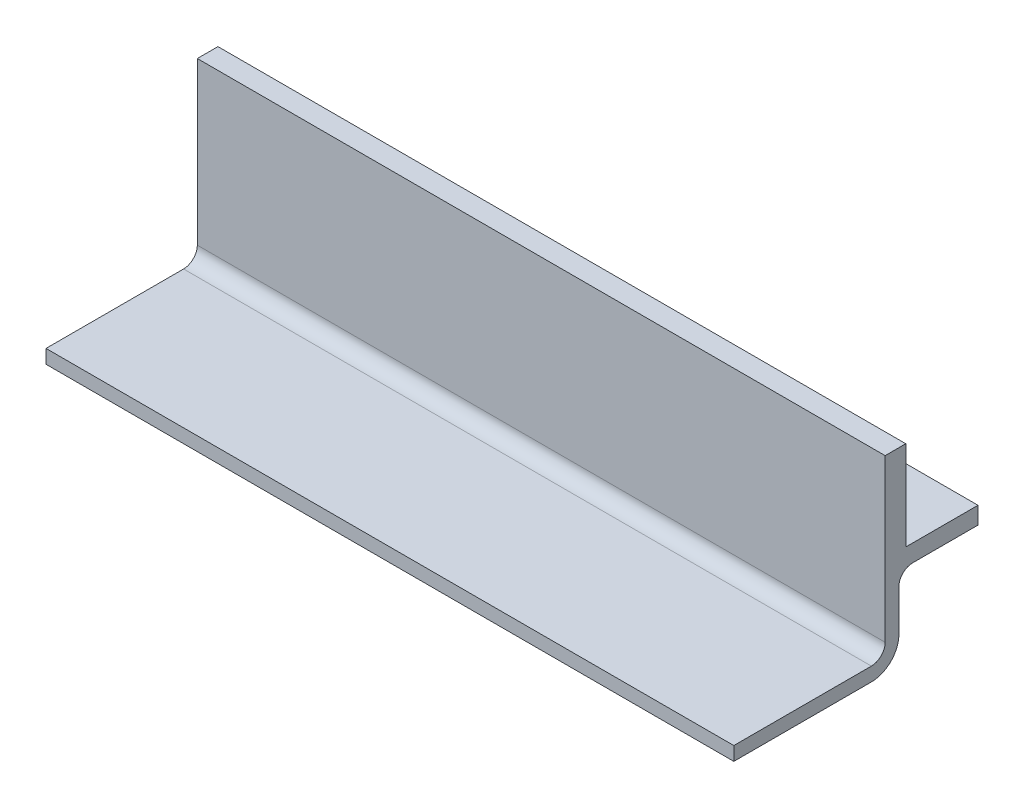
ISO-10303-21;
HEADER;
FILE_DESCRIPTION(('STEP AP214'),'2;1');
FILE_NAME('part.step','',(''),(''),'','','');
FILE_SCHEMA(('AUTOMOTIVE_DESIGN { 1 0 10303 214 1 1 1 1 }'));
ENDSEC;
DATA;
#1=APPLICATION_CONTEXT('core data for automotive mechanical design processes');
#2=APPLICATION_PROTOCOL_DEFINITION('international standard','automotive_design',2000,#1);
#3=PRODUCT_CONTEXT('',#1,'mechanical');
#4=PRODUCT('Part','Part','',(#3));
#5=PRODUCT_RELATED_PRODUCT_CATEGORY('part','',(#4));
#6=PRODUCT_DEFINITION_FORMATION('','',#4);
#7=PRODUCT_DEFINITION_CONTEXT('part definition',#1,'design');
#8=PRODUCT_DEFINITION('design','',#6,#7);
#9=PRODUCT_DEFINITION_SHAPE('','',#8);
#10=(LENGTH_UNIT() NAMED_UNIT(*) SI_UNIT(.MILLI.,.METRE.));
#11=(NAMED_UNIT(*) PLANE_ANGLE_UNIT() SI_UNIT($,.RADIAN.));
#12=(NAMED_UNIT(*) SI_UNIT($,.STERADIAN.) SOLID_ANGLE_UNIT());
#13=UNCERTAINTY_MEASURE_WITH_UNIT(LENGTH_MEASURE(1.E-05),#10,'distance_accuracy_value','');
#14=(GEOMETRIC_REPRESENTATION_CONTEXT(3) GLOBAL_UNCERTAINTY_ASSIGNED_CONTEXT((#13)) GLOBAL_UNIT_ASSIGNED_CONTEXT((#10,
#11,#12)) REPRESENTATION_CONTEXT('',''));
#15=CARTESIAN_POINT('',(0.,0.,0.));
#16=DIRECTION('',(0.,0.,1.));
#17=DIRECTION('',(1.,0.,0.));
#18=AXIS2_PLACEMENT_3D('',#15,#16,#17);
#19=CARTESIAN_POINT('',(100.,-37.000000372529,10.0000001490116));
#20=DIRECTION('',(0.,0.,-1.));
#21=DIRECTION('',(-1.,0.,0.));
#22=AXIS2_PLACEMENT_3D('',#19,#20,#21);
#23=PLANE('',#22);
#24=DIRECTION('',(-1.,0.,0.));
#25=VECTOR('',#24,1.);
#26=CARTESIAN_POINT('',(100.,-22.5000000061548,10.0000001490116));
#27=LINE('',#26,#25);
#28=CARTESIAN_POINT('',(100.,-22.5000000061548,10.0000001490116));
#29=VERTEX_POINT('',#28);
#30=CARTESIAN_POINT('',(0.,-22.5000000061548,10.0000001490116));
#31=VERTEX_POINT('',#30);
#32=EDGE_CURVE('E212',#29,#31,#27,.T.);
#33=ORIENTED_EDGE('',*,*,#32,.F.);
#34=DIRECTION('',(0.,1.,0.));
#35=VECTOR('',#34,1.);
#36=CARTESIAN_POINT('',(100.,-37.000000372529,10.0000001490116));
#37=LINE('',#36,#35);
#38=CARTESIAN_POINT('',(100.,-25.000000372529,10.0000001490116));
#39=VERTEX_POINT('',#38);
#40=EDGE_CURVE('E157',#39,#29,#37,.T.);
#41=ORIENTED_EDGE('',*,*,#40,.F.);
#42=DIRECTION('',(-1.,0.,0.));
#43=VECTOR('',#42,1.);
#44=CARTESIAN_POINT('',(100.,-25.000000372529,10.0000001490116));
#45=LINE('',#44,#43);
#46=CARTESIAN_POINT('',(0.,-25.000000372529,10.0000001490116));
#47=VERTEX_POINT('',#46);
#48=EDGE_CURVE('E221',#39,#47,#45,.T.);
#49=ORIENTED_EDGE('',*,*,#48,.T.);
#50=DIRECTION('',(0.,1.,0.));
#51=VECTOR('',#50,1.);
#52=CARTESIAN_POINT('',(0.,-37.000000372529,10.0000001490116));
#53=LINE('',#52,#51);
#54=EDGE_CURVE('E163',#47,#31,#53,.T.);
#55=ORIENTED_EDGE('',*,*,#54,.T.);
#56=EDGE_LOOP('',(#33,#41,#49,#55));
#57=FACE_BOUND('',#56,.T.);
#58=ADVANCED_FACE('F37',(#57),#23,.T.);
#59=CARTESIAN_POINT('',(100.,-37.000000372529,45.5000000000001));
#60=DIRECTION('',(1.,0.,0.));
#61=DIRECTION('',(0.,0.,-1.));
#62=AXIS2_PLACEMENT_3D('',#59,#60,#61);
#63=PLANE('',#62);
#64=DIRECTION('',(0.,0.,-1.));
#65=VECTOR('',#64,1.);
#66=CARTESIAN_POINT('',(100.,-37.000000372529,45.5000000000001));
#67=LINE('',#66,#65);
#68=CARTESIAN_POINT('',(100.,-37.000000372529,45.5000000000001));
#69=VERTEX_POINT('',#68);
#70=CARTESIAN_POINT('',(100.,-37.000000372529,25.5));
#71=VERTEX_POINT('',#70);
#72=EDGE_CURVE('E169',#69,#71,#67,.T.);
#73=ORIENTED_EDGE('',*,*,#72,.T.);
#74=CARTESIAN_POINT('',(100.,-33.000000372529,25.5));
#75=DIRECTION('',(1.,0.,0.));
#76=DIRECTION('',(0.,0.,-1.));
#77=AXIS2_PLACEMENT_3D('',#74,#75,#76);
#78=CIRCLE('',#77,4.);
#79=CARTESIAN_POINT('',(100.,-33.000000372529,21.5));
#80=VERTEX_POINT('',#79);
#81=EDGE_CURVE('E11',#71,#80,#78,.T.);
#82=ORIENTED_EDGE('',*,*,#81,.T.);
#83=DIRECTION('',(0.,1.,0.));
#84=VECTOR('',#83,1.);
#85=CARTESIAN_POINT('',(100.,-37.0000003725291,21.5));
#86=LINE('',#85,#84);
#87=CARTESIAN_POINT('',(100.,-27.000000372529,21.5));
#88=VERTEX_POINT('',#87);
#89=EDGE_CURVE('E205',#80,#88,#86,.T.);
#90=ORIENTED_EDGE('',*,*,#89,.T.);
#91=CARTESIAN_POINT('',(100.,-27.000000372529,19.5));
#92=DIRECTION('',(1.,0.,0.));
#93=DIRECTION('',(0.,0.,-1.));
#94=AXIS2_PLACEMENT_3D('',#91,#92,#93);
#95=CIRCLE('',#94,2.);
#96=CARTESIAN_POINT('',(100.,-25.000000372529,19.5));
#97=VERTEX_POINT('',#96);
#98=EDGE_CURVE('E195',#88,#97,#95,.F.);
#99=ORIENTED_EDGE('',*,*,#98,.T.);
#100=DIRECTION('',(0.,0.,-1.));
#101=VECTOR('',#100,1.);
#102=CARTESIAN_POINT('',(100.,-25.000000372529,21.5));
#103=LINE('',#102,#101);
#104=EDGE_CURVE('E218',#97,#39,#103,.T.);
#105=ORIENTED_EDGE('',*,*,#104,.T.);
#106=ORIENTED_EDGE('',*,*,#40,.T.);
#107=DIRECTION('',(0.,0.,1.));
#108=VECTOR('',#107,1.);
#109=CARTESIAN_POINT('',(100.,-22.5000000061548,10.0000001490116));
#110=LINE('',#109,#108);
#111=CARTESIAN_POINT('',(100.,-22.5000000061547,20.5));
#112=VERTEX_POINT('',#111);
#113=EDGE_CURVE('E248',#29,#112,#110,.T.);
#114=ORIENTED_EDGE('',*,*,#113,.T.);
#115=DIRECTION('',(0.,1.,0.));
#116=VECTOR('',#115,1.);
#117=CARTESIAN_POINT('',(100.,-22.5000000061547,20.5));
#118=LINE('',#117,#116);
#119=CARTESIAN_POINT('',(100.,-9.5,20.5));
#120=VERTEX_POINT('',#119);
#121=EDGE_CURVE('E242',#112,#120,#118,.T.);
#122=ORIENTED_EDGE('',*,*,#121,.T.);
#123=DIRECTION('',(0.,0.,-1.));
#124=VECTOR('',#123,1.);
#125=CARTESIAN_POINT('',(100.,-9.5,45.5000000000001));
#126=LINE('',#125,#124);
#127=CARTESIAN_POINT('',(100.,-9.5,23.5));
#128=VERTEX_POINT('',#127);
#129=EDGE_CURVE('E227',#128,#120,#126,.T.);
#130=ORIENTED_EDGE('',*,*,#129,.F.);
#131=DIRECTION('',(0.,-1.,0.));
#132=VECTOR('',#131,1.);
#133=CARTESIAN_POINT('',(100.,-9.5,23.5));
#134=LINE('',#133,#132);
#135=CARTESIAN_POINT('',(100.,-33.000000372529,23.5));
#136=VERTEX_POINT('',#135);
#137=EDGE_CURVE('E143',#128,#136,#134,.T.);
#138=ORIENTED_EDGE('',*,*,#137,.T.);
#139=CARTESIAN_POINT('',(100.,-33.000000372529,25.5));
#140=DIRECTION('',(1.,0.,0.));
#141=DIRECTION('',(0.,0.,-1.));
#142=AXIS2_PLACEMENT_3D('',#139,#140,#141);
#143=CIRCLE('',#142,2.);
#144=CARTESIAN_POINT('',(100.,-35.000000372529,25.5));
#145=VERTEX_POINT('',#144);
#146=EDGE_CURVE('E138',#136,#145,#143,.F.);
#147=ORIENTED_EDGE('',*,*,#146,.T.);
#148=DIRECTION('',(0.,0.,1.));
#149=VECTOR('',#148,1.);
#150=CARTESIAN_POINT('',(100.,-35.000000372529,23.5));
#151=LINE('',#150,#149);
#152=CARTESIAN_POINT('',(100.,-35.000000372529,45.5));
#153=VERTEX_POINT('',#152);
#154=EDGE_CURVE('E130',#145,#153,#151,.T.);
#155=ORIENTED_EDGE('',*,*,#154,.T.);
#156=DIRECTION('',(0.,1.,0.));
#157=VECTOR('',#156,1.);
#158=CARTESIAN_POINT('',(100.,-37.000000372529,45.5000000000001));
#159=LINE('',#158,#157);
#160=EDGE_CURVE('E134',#69,#153,#159,.T.);
#161=ORIENTED_EDGE('',*,*,#160,.F.);
#162=EDGE_LOOP('',(#73,#82,#90,#99,#105,#106,#114,#122,#130,#138,#147,#155,#161));
#163=FACE_BOUND('',#162,.T.);
#164=ADVANCED_FACE('F132',(#163),#63,.T.);
#165=CARTESIAN_POINT('',(0.,-37.000000372529,45.5000000000001));
#166=DIRECTION('',(0.,0.,1.));
#167=DIRECTION('',(1.,0.,0.));
#168=AXIS2_PLACEMENT_3D('',#165,#166,#167);
#169=PLANE('',#168);
#170=DIRECTION('',(-1.,0.,0.));
#171=VECTOR('',#170,1.);
#172=CARTESIAN_POINT('',(100.,-35.000000372529,45.5));
#173=LINE('',#172,#171);
#174=CARTESIAN_POINT('',(0.,-35.000000372529,45.5));
#175=VERTEX_POINT('',#174);
#176=EDGE_CURVE('E142',#153,#175,#173,.T.);
#177=ORIENTED_EDGE('',*,*,#176,.T.);
#178=DIRECTION('',(0.,1.,0.));
#179=VECTOR('',#178,1.);
#180=CARTESIAN_POINT('',(0.,-37.000000372529,45.5000000000001));
#181=LINE('',#180,#179);
#182=CARTESIAN_POINT('',(0.,-37.000000372529,45.5000000000001));
#183=VERTEX_POINT('',#182);
#184=EDGE_CURVE('E158',#183,#175,#181,.T.);
#185=ORIENTED_EDGE('',*,*,#184,.F.);
#186=DIRECTION('',(1.,0.,0.));
#187=VECTOR('',#186,1.);
#188=CARTESIAN_POINT('',(0.,-37.000000372529,45.5000000000001));
#189=LINE('',#188,#187);
#190=EDGE_CURVE('E156',#183,#69,#189,.T.);
#191=ORIENTED_EDGE('',*,*,#190,.T.);
#192=ORIENTED_EDGE('',*,*,#160,.T.);
#193=EDGE_LOOP('',(#177,#185,#191,#192));
#194=FACE_BOUND('',#193,.T.);
#195=ADVANCED_FACE('F154',(#194),#169,.T.);
#196=CARTESIAN_POINT('',(0.,-37.000000372529,10.0000001490116));
#197=DIRECTION('',(-1.,0.,0.));
#198=DIRECTION('',(0.,0.,1.));
#199=AXIS2_PLACEMENT_3D('',#196,#197,#198);
#200=PLANE('',#199);
#201=DIRECTION('',(0.,1.,0.));
#202=VECTOR('',#201,1.);
#203=CARTESIAN_POINT('',(0.,-37.0000003725291,21.5));
#204=LINE('',#203,#202);
#205=CARTESIAN_POINT('',(0.,-33.000000372529,21.5));
#206=VERTEX_POINT('',#205);
#207=CARTESIAN_POINT('',(0.,-27.000000372529,21.5));
#208=VERTEX_POINT('',#207);
#209=EDGE_CURVE('E204',#206,#208,#204,.T.);
#210=ORIENTED_EDGE('',*,*,#209,.F.);
#211=CARTESIAN_POINT('',(0.,-33.000000372529,25.5));
#212=DIRECTION('',(-1.,0.,0.));
#213=DIRECTION('',(0.,0.,1.));
#214=AXIS2_PLACEMENT_3D('',#211,#212,#213);
#215=CIRCLE('',#214,4.);
#216=CARTESIAN_POINT('',(0.,-37.000000372529,25.5));
#217=VERTEX_POINT('',#216);
#218=EDGE_CURVE('E59',#206,#217,#215,.T.);
#219=ORIENTED_EDGE('',*,*,#218,.T.);
#220=DIRECTION('',(0.,0.,1.));
#221=VECTOR('',#220,1.);
#222=CARTESIAN_POINT('',(0.,-37.000000372529,10.0000001490116));
#223=LINE('',#222,#221);
#224=EDGE_CURVE('E225',#217,#183,#223,.T.);
#225=ORIENTED_EDGE('',*,*,#224,.T.);
#226=ORIENTED_EDGE('',*,*,#184,.T.);
#227=DIRECTION('',(0.,0.,1.));
#228=VECTOR('',#227,1.);
#229=CARTESIAN_POINT('',(0.,-35.000000372529,23.5));
#230=LINE('',#229,#228);
#231=CARTESIAN_POINT('',(0.,-35.000000372529,25.5));
#232=VERTEX_POINT('',#231);
#233=EDGE_CURVE('E148',#232,#175,#230,.T.);
#234=ORIENTED_EDGE('',*,*,#233,.F.);
#235=CARTESIAN_POINT('',(0.,-33.000000372529,25.5));
#236=DIRECTION('',(-1.,0.,0.));
#237=DIRECTION('',(0.,0.,1.));
#238=AXIS2_PLACEMENT_3D('',#235,#236,#237);
#239=CIRCLE('',#238,2.);
#240=CARTESIAN_POINT('',(0.,-33.000000372529,23.5));
#241=VERTEX_POINT('',#240);
#242=EDGE_CURVE('E189',#232,#241,#239,.F.);
#243=ORIENTED_EDGE('',*,*,#242,.T.);
#244=DIRECTION('',(0.,-1.,0.));
#245=VECTOR('',#244,1.);
#246=CARTESIAN_POINT('',(0.,-9.5,23.5));
#247=LINE('',#246,#245);
#248=CARTESIAN_POINT('',(0.,-9.5,23.5));
#249=VERTEX_POINT('',#248);
#250=EDGE_CURVE('E173',#249,#241,#247,.T.);
#251=ORIENTED_EDGE('',*,*,#250,.F.);
#252=DIRECTION('',(0.,0.,1.));
#253=VECTOR('',#252,1.);
#254=CARTESIAN_POINT('',(0.,-9.5,10.0000001490116));
#255=LINE('',#254,#253);
#256=CARTESIAN_POINT('',(0.,-9.5,20.5));
#257=VERTEX_POINT('',#256);
#258=EDGE_CURVE('E224',#257,#249,#255,.T.);
#259=ORIENTED_EDGE('',*,*,#258,.F.);
#260=DIRECTION('',(0.,1.,0.));
#261=VECTOR('',#260,1.);
#262=CARTESIAN_POINT('',(0.,-22.5000000061547,20.5));
#263=LINE('',#262,#261);
#264=CARTESIAN_POINT('',(0.,-22.5000000061547,20.5));
#265=VERTEX_POINT('',#264);
#266=EDGE_CURVE('E245',#265,#257,#263,.T.);
#267=ORIENTED_EDGE('',*,*,#266,.F.);
#268=DIRECTION('',(0.,0.,1.));
#269=VECTOR('',#268,1.);
#270=CARTESIAN_POINT('',(0.,-22.5000000061548,10.0000001490116));
#271=LINE('',#270,#269);
#272=EDGE_CURVE('E253',#31,#265,#271,.T.);
#273=ORIENTED_EDGE('',*,*,#272,.F.);
#274=ORIENTED_EDGE('',*,*,#54,.F.);
#275=DIRECTION('',(0.,0.,-1.));
#276=VECTOR('',#275,1.);
#277=CARTESIAN_POINT('',(0.,-25.000000372529,21.5));
#278=LINE('',#277,#276);
#279=CARTESIAN_POINT('',(0.,-25.000000372529,19.5));
#280=VERTEX_POINT('',#279);
#281=EDGE_CURVE('E211',#280,#47,#278,.T.);
#282=ORIENTED_EDGE('',*,*,#281,.F.);
#283=CARTESIAN_POINT('',(0.,-27.000000372529,19.5));
#284=DIRECTION('',(-1.,0.,0.));
#285=DIRECTION('',(0.,0.,1.));
#286=AXIS2_PLACEMENT_3D('',#283,#284,#285);
#287=CIRCLE('',#286,2.);
#288=EDGE_CURVE('E192',#280,#208,#287,.F.);
#289=ORIENTED_EDGE('',*,*,#288,.T.);
#290=EDGE_LOOP('',(#210,#219,#225,#226,#234,#243,#251,#259,#267,#273,#274,#282,#289));
#291=FACE_BOUND('',#290,.T.);
#292=ADVANCED_FACE('F208',(#291),#200,.T.);
#293=CARTESIAN_POINT('',(0.,-37.000000372529,0.));
#294=DIRECTION('',(0.,1.,0.));
#295=DIRECTION('',(0.,0.,1.));
#296=AXIS2_PLACEMENT_3D('',#293,#294,#295);
#297=PLANE('',#296);
#298=ORIENTED_EDGE('',*,*,#224,.F.);
#299=DIRECTION('',(-1.,0.,0.));
#300=VECTOR('',#299,1.);
#301=CARTESIAN_POINT('',(0.,-37.000000372529,25.5));
#302=LINE('',#301,#300);
#303=EDGE_CURVE('E45',#217,#71,#302,.F.);
#304=ORIENTED_EDGE('',*,*,#303,.T.);
#305=ORIENTED_EDGE('',*,*,#72,.F.);
#306=ORIENTED_EDGE('',*,*,#190,.F.);
#307=EDGE_LOOP('',(#298,#304,#305,#306));
#308=FACE_BOUND('',#307,.T.);
#309=ADVANCED_FACE('F331',(#308),#297,.F.);
#310=CARTESIAN_POINT('',(0.,-9.5,0.));
#311=DIRECTION('',(0.,1.,0.));
#312=DIRECTION('',(0.,0.,1.));
#313=AXIS2_PLACEMENT_3D('',#310,#311,#312);
#314=PLANE('',#313);
#315=DIRECTION('',(-1.,0.,0.));
#316=VECTOR('',#315,1.);
#317=CARTESIAN_POINT('',(100.,-9.5,23.5));
#318=LINE('',#317,#316);
#319=EDGE_CURVE('E152',#128,#249,#318,.T.);
#320=ORIENTED_EDGE('',*,*,#319,.F.);
#321=ORIENTED_EDGE('',*,*,#129,.T.);
#322=DIRECTION('',(-1.,0.,0.));
#323=VECTOR('',#322,1.);
#324=CARTESIAN_POINT('',(100.,-9.5,20.5));
#325=LINE('',#324,#323);
#326=EDGE_CURVE('E215',#120,#257,#325,.T.);
#327=ORIENTED_EDGE('',*,*,#326,.T.);
#328=ORIENTED_EDGE('',*,*,#258,.T.);
#329=EDGE_LOOP('',(#320,#321,#327,#328));
#330=FACE_BOUND('',#329,.T.);
#331=ADVANCED_FACE('F236',(#330),#314,.T.);
#332=CARTESIAN_POINT('',(100.,-37.0000003725291,21.5));
#333=DIRECTION('',(0.,0.,1.));
#334=DIRECTION('',(0.,-1.,0.));
#335=AXIS2_PLACEMENT_3D('',#332,#333,#334);
#336=PLANE('',#335);
#337=ORIENTED_EDGE('',*,*,#89,.F.);
#338=DIRECTION('',(-1.,0.,0.));
#339=VECTOR('',#338,1.);
#340=CARTESIAN_POINT('',(100.,-33.000000372529,21.5));
#341=LINE('',#340,#339);
#342=EDGE_CURVE('E197',#80,#206,#341,.T.);
#343=ORIENTED_EDGE('',*,*,#342,.T.);
#344=ORIENTED_EDGE('',*,*,#209,.T.);
#345=DIRECTION('',(-1.,0.,0.));
#346=VECTOR('',#345,1.);
#347=CARTESIAN_POINT('',(100.,-27.000000372529,21.5));
#348=LINE('',#347,#346);
#349=EDGE_CURVE('E186',#208,#88,#348,.F.);
#350=ORIENTED_EDGE('',*,*,#349,.T.);
#351=EDGE_LOOP('',(#337,#343,#344,#350));
#352=FACE_BOUND('',#351,.T.);
#353=ADVANCED_FACE('F203',(#352),#336,.F.);
#354=CARTESIAN_POINT('',(100.,-25.000000372529,21.5));
#355=DIRECTION('',(0.,1.,0.));
#356=DIRECTION('',(0.,0.,1.));
#357=AXIS2_PLACEMENT_3D('',#354,#355,#356);
#358=PLANE('',#357);
#359=CARTESIAN_POINT('',(15.,-25.000000372529,14.5000000461613));
#360=DIRECTION('',(0.,-1.,0.));
#361=DIRECTION('',(0.,0.,-1.));
#362=AXIS2_PLACEMENT_3D('',#359,#360,#361);
#363=CIRCLE('',#362,3.3);
#364=CARTESIAN_POINT('',(15.,-25.000000372529,11.2000000461613));
#365=VERTEX_POINT('',#364);
#366=EDGE_CURVE('E285',#365,#365,#363,.T.);
#367=ORIENTED_EDGE('',*,*,#366,.F.);
#368=EDGE_LOOP('',(#367));
#369=FACE_BOUND('',#368,.T.);
#370=CARTESIAN_POINT('',(85.,-25.000000372529,14.5000000461613));
#371=DIRECTION('',(0.,-1.,0.));
#372=DIRECTION('',(0.,0.,-1.));
#373=AXIS2_PLACEMENT_3D('',#370,#371,#372);
#374=CIRCLE('',#373,3.3);
#375=CARTESIAN_POINT('',(85.,-25.000000372529,11.2000000461613));
#376=VERTEX_POINT('',#375);
#377=EDGE_CURVE('E178',#376,#376,#374,.T.);
#378=ORIENTED_EDGE('',*,*,#377,.F.);
#379=EDGE_LOOP('',(#378));
#380=FACE_BOUND('',#379,.T.);
#381=ORIENTED_EDGE('',*,*,#104,.F.);
#382=DIRECTION('',(-1.,0.,0.));
#383=VECTOR('',#382,1.);
#384=CARTESIAN_POINT('',(0.,-25.000000372529,19.5));
#385=LINE('',#384,#383);
#386=EDGE_CURVE('E183',#97,#280,#385,.T.);
#387=ORIENTED_EDGE('',*,*,#386,.T.);
#388=ORIENTED_EDGE('',*,*,#281,.T.);
#389=ORIENTED_EDGE('',*,*,#48,.F.);
#390=EDGE_LOOP('',(#381,#387,#388,#389));
#391=FACE_BOUND('',#390,.T.);
#392=ADVANCED_FACE('F262',(#369,#380,#391),#358,.F.);
#393=CARTESIAN_POINT('',(100.,-22.5000000061548,10.0000001490116));
#394=DIRECTION('',(0.,-1.,0.));
#395=DIRECTION('',(0.,0.,-1.));
#396=AXIS2_PLACEMENT_3D('',#393,#394,#395);
#397=PLANE('',#396);
#398=CARTESIAN_POINT('',(15.,-22.5000000061548,14.5000000461613));
#399=DIRECTION('',(0.,-1.,0.));
#400=DIRECTION('',(0.,0.,-1.));
#401=AXIS2_PLACEMENT_3D('',#398,#399,#400);
#402=CIRCLE('',#401,1.99999999999999);
#403=CARTESIAN_POINT('',(15.,-22.5000000061548,12.5000000461613));
#404=VERTEX_POINT('',#403);
#405=EDGE_CURVE('E175',#404,#404,#402,.T.);
#406=ORIENTED_EDGE('',*,*,#405,.T.);
#407=EDGE_LOOP('',(#406));
#408=FACE_BOUND('',#407,.T.);
#409=CARTESIAN_POINT('',(85.,-22.5000000061548,14.5000000461613));
#410=DIRECTION('',(0.,-1.,0.));
#411=DIRECTION('',(0.,0.,-1.));
#412=AXIS2_PLACEMENT_3D('',#409,#410,#411);
#413=CIRCLE('',#412,1.99999999999999);
#414=CARTESIAN_POINT('',(85.,-22.5000000061548,12.5000000461613));
#415=VERTEX_POINT('',#414);
#416=EDGE_CURVE('E170',#415,#415,#413,.T.);
#417=ORIENTED_EDGE('',*,*,#416,.T.);
#418=EDGE_LOOP('',(#417));
#419=FACE_BOUND('',#418,.T.);
#420=ORIENTED_EDGE('',*,*,#272,.T.);
#421=DIRECTION('',(-1.,0.,0.));
#422=VECTOR('',#421,1.);
#423=CARTESIAN_POINT('',(100.,-22.5000000061547,20.5));
#424=LINE('',#423,#422);
#425=EDGE_CURVE('E246',#112,#265,#424,.T.);
#426=ORIENTED_EDGE('',*,*,#425,.F.);
#427=ORIENTED_EDGE('',*,*,#113,.F.);
#428=ORIENTED_EDGE('',*,*,#32,.T.);
#429=EDGE_LOOP('',(#420,#426,#427,#428));
#430=FACE_BOUND('',#429,.T.);
#431=ADVANCED_FACE('F268',(#408,#419,#430),#397,.F.);
#432=CARTESIAN_POINT('',(100.,-22.5000000061547,20.5));
#433=DIRECTION('',(0.,0.,1.));
#434=DIRECTION('',(1.,0.,0.));
#435=AXIS2_PLACEMENT_3D('',#432,#433,#434);
#436=PLANE('',#435);
#437=ORIENTED_EDGE('',*,*,#266,.T.);
#438=ORIENTED_EDGE('',*,*,#326,.F.);
#439=ORIENTED_EDGE('',*,*,#121,.F.);
#440=ORIENTED_EDGE('',*,*,#425,.T.);
#441=EDGE_LOOP('',(#437,#438,#439,#440));
#442=FACE_BOUND('',#441,.T.);
#443=ADVANCED_FACE('F241',(#442),#436,.F.);
#444=CARTESIAN_POINT('',(100.,-9.5,23.5));
#445=DIRECTION('',(0.,0.,-1.));
#446=DIRECTION('',(0.,1.,0.));
#447=AXIS2_PLACEMENT_3D('',#444,#445,#446);
#448=PLANE('',#447);
#449=ORIENTED_EDGE('',*,*,#250,.T.);
#450=DIRECTION('',(-1.,0.,0.));
#451=VECTOR('',#450,1.);
#452=CARTESIAN_POINT('',(100.,-33.000000372529,23.5));
#453=LINE('',#452,#451);
#454=EDGE_CURVE('E181',#241,#136,#453,.F.);
#455=ORIENTED_EDGE('',*,*,#454,.T.);
#456=ORIENTED_EDGE('',*,*,#137,.F.);
#457=ORIENTED_EDGE('',*,*,#319,.T.);
#458=EDGE_LOOP('',(#449,#455,#456,#457));
#459=FACE_BOUND('',#458,.T.);
#460=ADVANCED_FACE('F277',(#459),#448,.F.);
#461=CARTESIAN_POINT('',(100.,-35.000000372529,23.5));
#462=DIRECTION('',(0.,-1.,0.));
#463=DIRECTION('',(0.,0.,-1.));
#464=AXIS2_PLACEMENT_3D('',#461,#462,#463);
#465=PLANE('',#464);
#466=ORIENTED_EDGE('',*,*,#154,.F.);
#467=DIRECTION('',(-1.,0.,0.));
#468=VECTOR('',#467,1.);
#469=CARTESIAN_POINT('',(0.,-35.000000372529,25.5));
#470=LINE('',#469,#468);
#471=EDGE_CURVE('E161',#145,#232,#470,.T.);
#472=ORIENTED_EDGE('',*,*,#471,.T.);
#473=ORIENTED_EDGE('',*,*,#233,.T.);
#474=ORIENTED_EDGE('',*,*,#176,.F.);
#475=EDGE_LOOP('',(#466,#472,#473,#474));
#476=FACE_BOUND('',#475,.T.);
#477=ADVANCED_FACE('F146',(#476),#465,.F.);
#478=CARTESIAN_POINT('',(85.,-25.000000372529,14.5000000461613));
#479=DIRECTION('',(0.,-1.,0.));
#480=DIRECTION('',(0.,0.,-1.));
#481=AXIS2_PLACEMENT_3D('',#478,#479,#480);
#482=CYLINDRICAL_SURFACE('',#481,1.99999999999999);
#483=CARTESIAN_POINT('',(85.,-23.700000372529,14.5000000461613));
#484=DIRECTION('',(0.,-1.,0.));
#485=DIRECTION('',(0.,0.,-1.));
#486=AXIS2_PLACEMENT_3D('',#483,#484,#485);
#487=CIRCLE('',#486,1.99999999999999);
#488=CARTESIAN_POINT('',(85.,-23.700000372529,12.5000000461613));
#489=VERTEX_POINT('',#488);
#490=EDGE_CURVE('E174',#489,#489,#487,.T.);
#491=ORIENTED_EDGE('',*,*,#490,.T.);
#492=EDGE_LOOP('',(#491));
#493=FACE_BOUND('',#492,.T.);
#494=ORIENTED_EDGE('',*,*,#416,.F.);
#495=EDGE_LOOP('',(#494));
#496=FACE_BOUND('',#495,.T.);
#497=ADVANCED_FACE('F299',(#493,#496),#482,.F.);
#498=CARTESIAN_POINT('',(85.,-25.000000372529,14.5000000461613));
#499=DIRECTION('',(0.,-1.,0.));
#500=DIRECTION('',(0.,0.,-1.));
#501=AXIS2_PLACEMENT_3D('',#498,#499,#500);
#502=CONICAL_SURFACE('',#501,3.3,0.785398163397442);
#503=ORIENTED_EDGE('',*,*,#490,.F.);
#504=EDGE_LOOP('',(#503));
#505=FACE_BOUND('',#504,.T.);
#506=ORIENTED_EDGE('',*,*,#377,.T.);
#507=EDGE_LOOP('',(#506));
#508=FACE_BOUND('',#507,.T.);
#509=ADVANCED_FACE('F296',(#505,#508),#502,.F.);
#510=CARTESIAN_POINT('',(15.,-25.000000372529,14.5000000461613));
#511=DIRECTION('',(0.,-1.,0.));
#512=DIRECTION('',(0.,0.,-1.));
#513=AXIS2_PLACEMENT_3D('',#510,#511,#512);
#514=CYLINDRICAL_SURFACE('',#513,1.99999999999999);
#515=CARTESIAN_POINT('',(15.,-23.700000372529,14.5000000461613));
#516=DIRECTION('',(0.,-1.,0.));
#517=DIRECTION('',(0.,0.,-1.));
#518=AXIS2_PLACEMENT_3D('',#515,#516,#517);
#519=CIRCLE('',#518,1.99999999999999);
#520=CARTESIAN_POINT('',(15.,-23.700000372529,12.5000000461613));
#521=VERTEX_POINT('',#520);
#522=EDGE_CURVE('E179',#521,#521,#519,.T.);
#523=ORIENTED_EDGE('',*,*,#522,.T.);
#524=EDGE_LOOP('',(#523));
#525=FACE_BOUND('',#524,.T.);
#526=ORIENTED_EDGE('',*,*,#405,.F.);
#527=EDGE_LOOP('',(#526));
#528=FACE_BOUND('',#527,.T.);
#529=ADVANCED_FACE('F298',(#525,#528),#514,.F.);
#530=CARTESIAN_POINT('',(15.,-25.000000372529,14.5000000461613));
#531=DIRECTION('',(0.,-1.,0.));
#532=DIRECTION('',(0.,0.,-1.));
#533=AXIS2_PLACEMENT_3D('',#530,#531,#532);
#534=CONICAL_SURFACE('',#533,3.3,0.785398163397443);
#535=ORIENTED_EDGE('',*,*,#522,.F.);
#536=EDGE_LOOP('',(#535));
#537=FACE_BOUND('',#536,.T.);
#538=ORIENTED_EDGE('',*,*,#366,.T.);
#539=EDGE_LOOP('',(#538));
#540=FACE_BOUND('',#539,.T.);
#541=ADVANCED_FACE('F289',(#537,#540),#534,.F.);
#542=CARTESIAN_POINT('',(100.,-33.000000372529,25.5));
#543=DIRECTION('',(1.,0.,0.));
#544=DIRECTION('',(0.,0.,-1.));
#545=AXIS2_PLACEMENT_3D('',#542,#543,#544);
#546=CYLINDRICAL_SURFACE('',#545,2.);
#547=ORIENTED_EDGE('',*,*,#146,.F.);
#548=ORIENTED_EDGE('',*,*,#454,.F.);
#549=ORIENTED_EDGE('',*,*,#242,.F.);
#550=ORIENTED_EDGE('',*,*,#471,.F.);
#551=EDGE_LOOP('',(#547,#548,#549,#550));
#552=FACE_BOUND('',#551,.T.);
#553=ADVANCED_FACE('F320',(#552),#546,.F.);
#554=CARTESIAN_POINT('',(100.,-27.000000372529,19.5));
#555=DIRECTION('',(1.,0.,0.));
#556=DIRECTION('',(0.,0.,-1.));
#557=AXIS2_PLACEMENT_3D('',#554,#555,#556);
#558=CYLINDRICAL_SURFACE('',#557,2.);
#559=ORIENTED_EDGE('',*,*,#98,.F.);
#560=ORIENTED_EDGE('',*,*,#349,.F.);
#561=ORIENTED_EDGE('',*,*,#288,.F.);
#562=ORIENTED_EDGE('',*,*,#386,.F.);
#563=EDGE_LOOP('',(#559,#560,#561,#562));
#564=FACE_BOUND('',#563,.T.);
#565=ADVANCED_FACE('F322',(#564),#558,.F.);
#566=CARTESIAN_POINT('',(100.,-33.000000372529,25.5));
#567=DIRECTION('',(-1.,0.,0.));
#568=DIRECTION('',(0.,0.,1.));
#569=AXIS2_PLACEMENT_3D('',#566,#567,#568);
#570=CYLINDRICAL_SURFACE('',#569,4.);
#571=ORIENTED_EDGE('',*,*,#81,.F.);
#572=ORIENTED_EDGE('',*,*,#303,.F.);
#573=ORIENTED_EDGE('',*,*,#218,.F.);
#574=ORIENTED_EDGE('',*,*,#342,.F.);
#575=EDGE_LOOP('',(#571,#572,#573,#574));
#576=FACE_BOUND('',#575,.T.);
#577=ADVANCED_FACE('F39',(#576),#570,.T.);
#578=CLOSED_SHELL('',(#58,#164,#195,#292,#309,#331,#353,#392,#431,#443,#460,#477,#497,#509,#529,
#541,#553,#565,#577));
#579=MANIFOLD_SOLID_BREP('B2',#578);
#580=ADVANCED_BREP_SHAPE_REPRESENTATION('',(#18,#579),#14);
#581=SHAPE_DEFINITION_REPRESENTATION(#9,#580);
ENDSEC;
END-ISO-10303-21;
